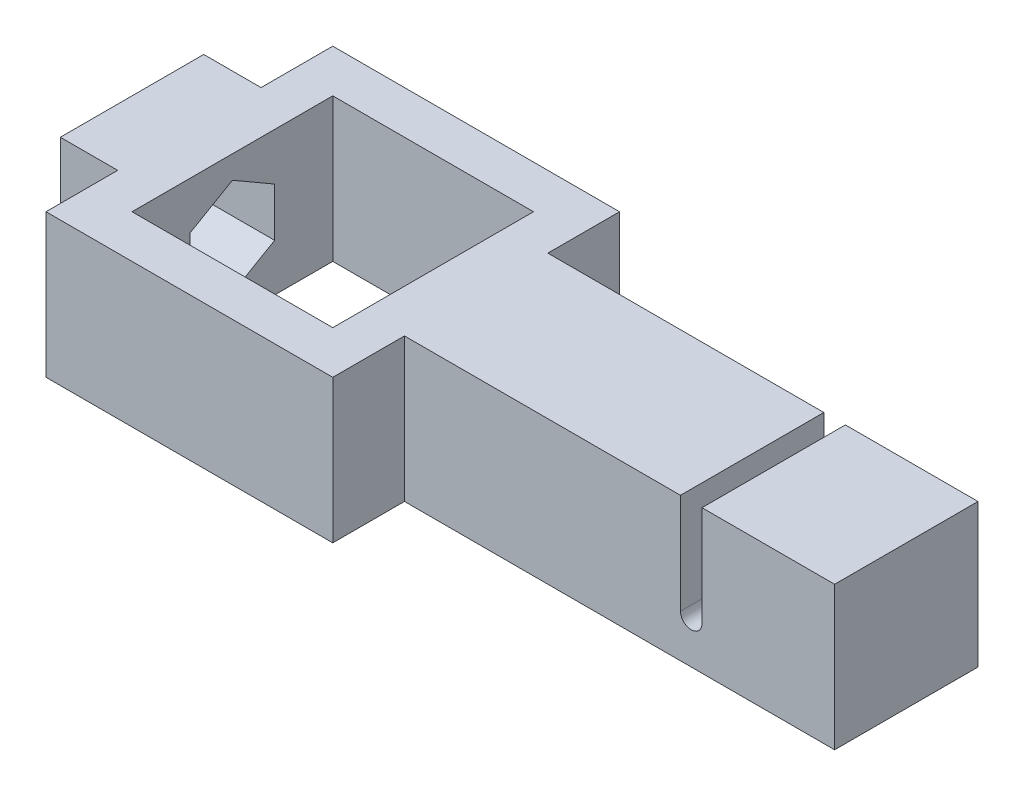
ISO-10303-21;
HEADER;
FILE_DESCRIPTION(('STEP AP214'),'2;1');
FILE_NAME('part.step','',(''),(''),'','','');
FILE_SCHEMA(('AUTOMOTIVE_DESIGN { 1 0 10303 214 1 1 1 1 }'));
ENDSEC;
DATA;
#1=APPLICATION_CONTEXT('core data for automotive mechanical design processes');
#2=APPLICATION_PROTOCOL_DEFINITION('international standard','automotive_design',2000,#1);
#3=PRODUCT_CONTEXT('',#1,'mechanical');
#4=PRODUCT('Part','Part','',(#3));
#5=PRODUCT_RELATED_PRODUCT_CATEGORY('part','',(#4));
#6=PRODUCT_DEFINITION_FORMATION('','',#4);
#7=PRODUCT_DEFINITION_CONTEXT('part definition',#1,'design');
#8=PRODUCT_DEFINITION('design','',#6,#7);
#9=PRODUCT_DEFINITION_SHAPE('','',#8);
#10=(LENGTH_UNIT() NAMED_UNIT(*) SI_UNIT(.MILLI.,.METRE.));
#11=(NAMED_UNIT(*) PLANE_ANGLE_UNIT() SI_UNIT($,.RADIAN.));
#12=(NAMED_UNIT(*) SI_UNIT($,.STERADIAN.) SOLID_ANGLE_UNIT());
#13=UNCERTAINTY_MEASURE_WITH_UNIT(LENGTH_MEASURE(1.E-05),#10,'distance_accuracy_value','');
#14=(GEOMETRIC_REPRESENTATION_CONTEXT(3) GLOBAL_UNCERTAINTY_ASSIGNED_CONTEXT((#13)) GLOBAL_UNIT_ASSIGNED_CONTEXT((#10,
#11,#12)) REPRESENTATION_CONTEXT('',''));
#15=CARTESIAN_POINT('',(0.,0.,0.));
#16=DIRECTION('',(0.,0.,1.));
#17=DIRECTION('',(1.,0.,0.));
#18=AXIS2_PLACEMENT_3D('',#15,#16,#17);
#19=CARTESIAN_POINT('',(0.,10.,0.));
#20=DIRECTION('',(0.,-1.,0.));
#21=DIRECTION('',(0.,0.,-1.));
#22=AXIS2_PLACEMENT_3D('',#19,#20,#21);
#23=PLANE('',#22);
#24=DIRECTION('',(0.,0.,1.));
#25=VECTOR('',#24,1.);
#26=CARTESIAN_POINT('',(-17.,10.,-12.));
#27=LINE('',#26,#25);
#28=CARTESIAN_POINT('',(-17.,10.,-12.));
#29=VERTEX_POINT('',#28);
#30=CARTESIAN_POINT('',(-17.,10.,2.));
#31=VERTEX_POINT('',#30);
#32=EDGE_CURVE('E293',#29,#31,#27,.T.);
#33=ORIENTED_EDGE('',*,*,#32,.F.);
#34=DIRECTION('',(-1.,0.,0.));
#35=VECTOR('',#34,1.);
#36=CARTESIAN_POINT('',(-17.,10.,-12.));
#37=LINE('',#36,#35);
#38=CARTESIAN_POINT('',(-3.,10.,-12.));
#39=VERTEX_POINT('',#38);
#40=EDGE_CURVE('E301',#39,#29,#37,.T.);
#41=ORIENTED_EDGE('',*,*,#40,.F.);
#42=DIRECTION('',(0.,0.,-1.));
#43=VECTOR('',#42,1.);
#44=CARTESIAN_POINT('',(-3.,10.,-12.));
#45=LINE('',#44,#43);
#46=CARTESIAN_POINT('',(-3.,10.,2.));
#47=VERTEX_POINT('',#46);
#48=EDGE_CURVE('E298',#47,#39,#45,.T.);
#49=ORIENTED_EDGE('',*,*,#48,.F.);
#50=DIRECTION('',(1.,0.,0.));
#51=VECTOR('',#50,1.);
#52=CARTESIAN_POINT('',(-17.,10.,2.));
#53=LINE('',#52,#51);
#54=EDGE_CURVE('E295',#31,#47,#53,.T.);
#55=ORIENTED_EDGE('',*,*,#54,.F.);
#56=EDGE_LOOP('',(#33,#41,#49,#55));
#57=FACE_BOUND('',#56,.T.);
#58=DIRECTION('',(1.,0.,0.));
#59=VECTOR('',#58,1.);
#60=CARTESIAN_POINT('',(0.,10.,0.));
#61=LINE('',#60,#59);
#62=CARTESIAN_POINT('',(0.,10.,0.));
#63=VERTEX_POINT('',#62);
#64=CARTESIAN_POINT('',(19.25,10.,0.));
#65=VERTEX_POINT('',#64);
#66=EDGE_CURVE('E329',#63,#65,#61,.T.);
#67=ORIENTED_EDGE('',*,*,#66,.T.);
#68=DIRECTION('',(0.,0.,1.));
#69=VECTOR('',#68,1.);
#70=CARTESIAN_POINT('',(19.25,10.,-15.001));
#71=LINE('',#70,#69);
#72=CARTESIAN_POINT('',(19.25,10.,-10.));
#73=VERTEX_POINT('',#72);
#74=EDGE_CURVE('E281',#73,#65,#71,.T.);
#75=ORIENTED_EDGE('',*,*,#74,.F.);
#76=DIRECTION('',(-1.,0.,0.));
#77=VECTOR('',#76,1.);
#78=CARTESIAN_POINT('',(0.,10.,-10.));
#79=LINE('',#78,#77);
#80=CARTESIAN_POINT('',(0.,10.,-10.));
#81=VERTEX_POINT('',#80);
#82=EDGE_CURVE('E334',#73,#81,#79,.T.);
#83=ORIENTED_EDGE('',*,*,#82,.T.);
#84=DIRECTION('',(0.,0.,-1.));
#85=VECTOR('',#84,1.);
#86=CARTESIAN_POINT('',(0.,10.,-15.));
#87=LINE('',#86,#85);
#88=CARTESIAN_POINT('',(0.,10.,-15.));
#89=VERTEX_POINT('',#88);
#90=EDGE_CURVE('E338',#81,#89,#87,.T.);
#91=ORIENTED_EDGE('',*,*,#90,.T.);
#92=DIRECTION('',(-1.,0.,0.));
#93=VECTOR('',#92,1.);
#94=CARTESIAN_POINT('',(-20.,10.,-15.));
#95=LINE('',#94,#93);
#96=CARTESIAN_POINT('',(-20.,10.,-15.));
#97=VERTEX_POINT('',#96);
#98=EDGE_CURVE('E340',#89,#97,#95,.T.);
#99=ORIENTED_EDGE('',*,*,#98,.T.);
#100=DIRECTION('',(0.,0.,1.));
#101=VECTOR('',#100,1.);
#102=CARTESIAN_POINT('',(-20.,10.,-10.));
#103=LINE('',#102,#101);
#104=CARTESIAN_POINT('',(-20.,10.,-10.));
#105=VERTEX_POINT('',#104);
#106=EDGE_CURVE('E342',#97,#105,#103,.T.);
#107=ORIENTED_EDGE('',*,*,#106,.T.);
#108=DIRECTION('',(-1.,0.,0.));
#109=VECTOR('',#108,1.);
#110=CARTESIAN_POINT('',(-20.,10.,-10.));
#111=LINE('',#110,#109);
#112=CARTESIAN_POINT('',(-24.,10.,-10.));
#113=VERTEX_POINT('',#112);
#114=EDGE_CURVE('E344',#105,#113,#111,.T.);
#115=ORIENTED_EDGE('',*,*,#114,.T.);
#116=DIRECTION('',(0.,0.,1.));
#117=VECTOR('',#116,1.);
#118=CARTESIAN_POINT('',(-24.,10.,-10.));
#119=LINE('',#118,#117);
#120=CARTESIAN_POINT('',(-24.,10.,0.));
#121=VERTEX_POINT('',#120);
#122=EDGE_CURVE('E346',#113,#121,#119,.T.);
#123=ORIENTED_EDGE('',*,*,#122,.T.);
#124=DIRECTION('',(1.,0.,0.));
#125=VECTOR('',#124,1.);
#126=CARTESIAN_POINT('',(-24.,10.,0.));
#127=LINE('',#126,#125);
#128=CARTESIAN_POINT('',(-20.,10.,0.));
#129=VERTEX_POINT('',#128);
#130=EDGE_CURVE('E348',#121,#129,#127,.T.);
#131=ORIENTED_EDGE('',*,*,#130,.T.);
#132=DIRECTION('',(0.,0.,1.));
#133=VECTOR('',#132,1.);
#134=CARTESIAN_POINT('',(-20.,10.,5.));
#135=LINE('',#134,#133);
#136=CARTESIAN_POINT('',(-20.,10.,5.));
#137=VERTEX_POINT('',#136);
#138=EDGE_CURVE('E350',#129,#137,#135,.T.);
#139=ORIENTED_EDGE('',*,*,#138,.T.);
#140=DIRECTION('',(1.,0.,0.));
#141=VECTOR('',#140,1.);
#142=CARTESIAN_POINT('',(0.,10.,5.));
#143=LINE('',#142,#141);
#144=CARTESIAN_POINT('',(0.,10.,5.));
#145=VERTEX_POINT('',#144);
#146=EDGE_CURVE('E352',#137,#145,#143,.T.);
#147=ORIENTED_EDGE('',*,*,#146,.T.);
#148=DIRECTION('',(0.,0.,-1.));
#149=VECTOR('',#148,1.);
#150=CARTESIAN_POINT('',(0.,10.,0.));
#151=LINE('',#150,#149);
#152=EDGE_CURVE('E324',#145,#63,#151,.T.);
#153=ORIENTED_EDGE('',*,*,#152,.T.);
#154=EDGE_LOOP('',(#67,#75,#83,#91,#99,#107,#115,#123,#131,#139,#147,#153));
#155=FACE_BOUND('',#154,.T.);
#156=ADVANCED_FACE('F32',(#57,#155),#23,.F.);
#157=CARTESIAN_POINT('',(30.,10.,-10.));
#158=VERTEX_POINT('',#157);
#159=CARTESIAN_POINT('',(20.75,10.,-10.));
#160=VERTEX_POINT('',#159);
#161=EDGE_CURVE('E335',#158,#160,#79,.T.);
#162=ORIENTED_EDGE('',*,*,#161,.T.);
#163=DIRECTION('',(0.,0.,1.));
#164=VECTOR('',#163,1.);
#165=CARTESIAN_POINT('',(20.75,10.,-15.001));
#166=LINE('',#165,#164);
#167=CARTESIAN_POINT('',(20.75,10.,0.));
#168=VERTEX_POINT('',#167);
#169=EDGE_CURVE('E284',#160,#168,#166,.T.);
#170=ORIENTED_EDGE('',*,*,#169,.T.);
#171=CARTESIAN_POINT('',(30.,10.,0.));
#172=VERTEX_POINT('',#171);
#173=EDGE_CURVE('E327',#168,#172,#61,.T.);
#174=ORIENTED_EDGE('',*,*,#173,.T.);
#175=DIRECTION('',(0.,0.,-1.));
#176=VECTOR('',#175,1.);
#177=CARTESIAN_POINT('',(30.,10.,0.));
#178=LINE('',#177,#176);
#179=EDGE_CURVE('E332',#172,#158,#178,.T.);
#180=ORIENTED_EDGE('',*,*,#179,.T.);
#181=EDGE_LOOP('',(#162,#170,#174,#180));
#182=FACE_BOUND('',#181,.T.);
#183=ADVANCED_FACE('F446',(#182),#23,.F.);
#184=CARTESIAN_POINT('',(0.,0.,0.));
#185=DIRECTION('',(0.,-1.,0.));
#186=DIRECTION('',(0.,0.,-1.));
#187=AXIS2_PLACEMENT_3D('',#184,#185,#186);
#188=PLANE('',#187);
#189=DIRECTION('',(0.,0.,-1.));
#190=VECTOR('',#189,1.);
#191=CARTESIAN_POINT('',(0.,0.,0.));
#192=LINE('',#191,#190);
#193=CARTESIAN_POINT('',(0.,0.,5.));
#194=VERTEX_POINT('',#193);
#195=CARTESIAN_POINT('',(0.,0.,0.));
#196=VERTEX_POINT('',#195);
#197=EDGE_CURVE('E323',#194,#196,#192,.T.);
#198=ORIENTED_EDGE('',*,*,#197,.F.);
#199=DIRECTION('',(1.,0.,0.));
#200=VECTOR('',#199,1.);
#201=CARTESIAN_POINT('',(0.,0.,5.));
#202=LINE('',#201,#200);
#203=CARTESIAN_POINT('',(-20.,0.,5.));
#204=VERTEX_POINT('',#203);
#205=EDGE_CURVE('E328',#204,#194,#202,.T.);
#206=ORIENTED_EDGE('',*,*,#205,.F.);
#207=DIRECTION('',(0.,0.,1.));
#208=VECTOR('',#207,1.);
#209=CARTESIAN_POINT('',(-20.,0.,5.));
#210=LINE('',#209,#208);
#211=CARTESIAN_POINT('',(-20.,0.,0.));
#212=VERTEX_POINT('',#211);
#213=EDGE_CURVE('E375',#212,#204,#210,.T.);
#214=ORIENTED_EDGE('',*,*,#213,.F.);
#215=DIRECTION('',(1.,0.,0.));
#216=VECTOR('',#215,1.);
#217=CARTESIAN_POINT('',(-24.,0.,0.));
#218=LINE('',#217,#216);
#219=CARTESIAN_POINT('',(-24.,0.,0.));
#220=VERTEX_POINT('',#219);
#221=EDGE_CURVE('E373',#220,#212,#218,.T.);
#222=ORIENTED_EDGE('',*,*,#221,.F.);
#223=DIRECTION('',(0.,0.,1.));
#224=VECTOR('',#223,1.);
#225=CARTESIAN_POINT('',(-24.,0.,-10.));
#226=LINE('',#225,#224);
#227=CARTESIAN_POINT('',(-24.,0.,-10.));
#228=VERTEX_POINT('',#227);
#229=EDGE_CURVE('E371',#228,#220,#226,.T.);
#230=ORIENTED_EDGE('',*,*,#229,.F.);
#231=DIRECTION('',(-1.,0.,0.));
#232=VECTOR('',#231,1.);
#233=CARTESIAN_POINT('',(-20.,0.,-10.));
#234=LINE('',#233,#232);
#235=CARTESIAN_POINT('',(-20.,0.,-10.));
#236=VERTEX_POINT('',#235);
#237=EDGE_CURVE('E369',#236,#228,#234,.T.);
#238=ORIENTED_EDGE('',*,*,#237,.F.);
#239=DIRECTION('',(0.,0.,1.));
#240=VECTOR('',#239,1.);
#241=CARTESIAN_POINT('',(-20.,0.,-10.));
#242=LINE('',#241,#240);
#243=CARTESIAN_POINT('',(-20.,0.,-15.));
#244=VERTEX_POINT('',#243);
#245=EDGE_CURVE('E367',#244,#236,#242,.T.);
#246=ORIENTED_EDGE('',*,*,#245,.F.);
#247=DIRECTION('',(-1.,0.,0.));
#248=VECTOR('',#247,1.);
#249=CARTESIAN_POINT('',(-20.,0.,-15.));
#250=LINE('',#249,#248);
#251=CARTESIAN_POINT('',(0.,0.,-15.));
#252=VERTEX_POINT('',#251);
#253=EDGE_CURVE('E365',#252,#244,#250,.T.);
#254=ORIENTED_EDGE('',*,*,#253,.F.);
#255=DIRECTION('',(0.,0.,-1.));
#256=VECTOR('',#255,1.);
#257=CARTESIAN_POINT('',(0.,0.,-15.));
#258=LINE('',#257,#256);
#259=CARTESIAN_POINT('',(0.,0.,-10.));
#260=VERTEX_POINT('',#259);
#261=EDGE_CURVE('E363',#260,#252,#258,.T.);
#262=ORIENTED_EDGE('',*,*,#261,.F.);
#263=DIRECTION('',(-1.,0.,0.));
#264=VECTOR('',#263,1.);
#265=CARTESIAN_POINT('',(0.,0.,-10.));
#266=LINE('',#265,#264);
#267=CARTESIAN_POINT('',(30.,0.,-10.));
#268=VERTEX_POINT('',#267);
#269=EDGE_CURVE('E361',#268,#260,#266,.T.);
#270=ORIENTED_EDGE('',*,*,#269,.F.);
#271=DIRECTION('',(0.,0.,-1.));
#272=VECTOR('',#271,1.);
#273=CARTESIAN_POINT('',(30.,0.,0.));
#274=LINE('',#273,#272);
#275=CARTESIAN_POINT('',(30.,0.,0.));
#276=VERTEX_POINT('',#275);
#277=EDGE_CURVE('E359',#276,#268,#274,.T.);
#278=ORIENTED_EDGE('',*,*,#277,.F.);
#279=DIRECTION('',(1.,0.,0.));
#280=VECTOR('',#279,1.);
#281=CARTESIAN_POINT('',(0.,0.,0.));
#282=LINE('',#281,#280);
#283=EDGE_CURVE('E357',#196,#276,#282,.T.);
#284=ORIENTED_EDGE('',*,*,#283,.F.);
#285=EDGE_LOOP('',(#198,#206,#214,#222,#230,#238,#246,#254,#262,#270,#278,#284));
#286=FACE_BOUND('',#285,.T.);
#287=DIRECTION('',(-1.,0.,0.));
#288=VECTOR('',#287,1.);
#289=CARTESIAN_POINT('',(-17.,0.,-12.));
#290=LINE('',#289,#288);
#291=CARTESIAN_POINT('',(-3.,0.,-12.));
#292=VERTEX_POINT('',#291);
#293=CARTESIAN_POINT('',(-17.,0.,-12.));
#294=VERTEX_POINT('',#293);
#295=EDGE_CURVE('E296',#292,#294,#290,.T.);
#296=ORIENTED_EDGE('',*,*,#295,.T.);
#297=DIRECTION('',(0.,0.,1.));
#298=VECTOR('',#297,1.);
#299=CARTESIAN_POINT('',(-17.,0.,-12.));
#300=LINE('',#299,#298);
#301=CARTESIAN_POINT('',(-17.,0.,2.));
#302=VERTEX_POINT('',#301);
#303=EDGE_CURVE('E292',#294,#302,#300,.T.);
#304=ORIENTED_EDGE('',*,*,#303,.T.);
#305=DIRECTION('',(1.,0.,0.));
#306=VECTOR('',#305,1.);
#307=CARTESIAN_POINT('',(-17.,0.,2.));
#308=LINE('',#307,#306);
#309=CARTESIAN_POINT('',(-3.,0.,2.));
#310=VERTEX_POINT('',#309);
#311=EDGE_CURVE('E306',#302,#310,#308,.T.);
#312=ORIENTED_EDGE('',*,*,#311,.T.);
#313=DIRECTION('',(0.,0.,-1.));
#314=VECTOR('',#313,1.);
#315=CARTESIAN_POINT('',(-3.,0.,-12.));
#316=LINE('',#315,#314);
#317=EDGE_CURVE('E309',#310,#292,#316,.T.);
#318=ORIENTED_EDGE('',*,*,#317,.T.);
#319=EDGE_LOOP('',(#296,#304,#312,#318));
#320=FACE_BOUND('',#319,.T.);
#321=ADVANCED_FACE('F418',(#286,#320),#188,.T.);
#322=CARTESIAN_POINT('',(0.,10.,0.));
#323=DIRECTION('',(-1.,0.,0.));
#324=DIRECTION('',(0.,0.,1.));
#325=AXIS2_PLACEMENT_3D('',#322,#323,#324);
#326=PLANE('',#325);
#327=ORIENTED_EDGE('',*,*,#197,.T.);
#328=DIRECTION('',(0.,-1.,0.));
#329=VECTOR('',#328,1.);
#330=CARTESIAN_POINT('',(0.,10.,0.));
#331=LINE('',#330,#329);
#332=EDGE_CURVE('E11',#63,#196,#331,.T.);
#333=ORIENTED_EDGE('',*,*,#332,.F.);
#334=ORIENTED_EDGE('',*,*,#152,.F.);
#335=DIRECTION('',(0.,-1.,0.));
#336=VECTOR('',#335,1.);
#337=CARTESIAN_POINT('',(0.,10.,5.));
#338=LINE('',#337,#336);
#339=EDGE_CURVE('E354',#145,#194,#338,.T.);
#340=ORIENTED_EDGE('',*,*,#339,.T.);
#341=EDGE_LOOP('',(#327,#333,#334,#340));
#342=FACE_BOUND('',#341,.T.);
#343=ADVANCED_FACE('F34',(#342),#326,.F.);
#344=CARTESIAN_POINT('',(0.,10.,0.));
#345=DIRECTION('',(0.,0.,-1.));
#346=DIRECTION('',(-1.,0.,0.));
#347=AXIS2_PLACEMENT_3D('',#344,#345,#346);
#348=PLANE('',#347);
#349=CARTESIAN_POINT('',(20.,3.,0.));
#350=DIRECTION('',(0.,0.,1.));
#351=DIRECTION('',(1.,0.,0.));
#352=AXIS2_PLACEMENT_3D('',#349,#350,#351);
#353=CIRCLE('',#352,0.750000000000001);
#354=CARTESIAN_POINT('',(19.25,3.,0.));
#355=VERTEX_POINT('',#354);
#356=CARTESIAN_POINT('',(20.75,3.,0.));
#357=VERTEX_POINT('',#356);
#358=EDGE_CURVE('E275',#355,#357,#353,.T.);
#359=ORIENTED_EDGE('',*,*,#358,.F.);
#360=DIRECTION('',(0.,-1.,0.));
#361=VECTOR('',#360,1.);
#362=CARTESIAN_POINT('',(19.25,10.,0.));
#363=LINE('',#362,#361);
#364=EDGE_CURVE('E272',#65,#355,#363,.T.);
#365=ORIENTED_EDGE('',*,*,#364,.F.);
#366=ORIENTED_EDGE('',*,*,#66,.F.);
#367=ORIENTED_EDGE('',*,*,#332,.T.);
#368=ORIENTED_EDGE('',*,*,#283,.T.);
#369=DIRECTION('',(0.,-1.,0.));
#370=VECTOR('',#369,1.);
#371=CARTESIAN_POINT('',(30.,10.,0.));
#372=LINE('',#371,#370);
#373=EDGE_CURVE('E40',#172,#276,#372,.T.);
#374=ORIENTED_EDGE('',*,*,#373,.F.);
#375=ORIENTED_EDGE('',*,*,#173,.F.);
#376=DIRECTION('',(0.,1.,0.));
#377=VECTOR('',#376,1.);
#378=CARTESIAN_POINT('',(20.75,10.,0.));
#379=LINE('',#378,#377);
#380=EDGE_CURVE('E278',#357,#168,#379,.T.);
#381=ORIENTED_EDGE('',*,*,#380,.F.);
#382=EDGE_LOOP('',(#359,#365,#366,#367,#368,#374,#375,#381));
#383=FACE_BOUND('',#382,.T.);
#384=ADVANCED_FACE('F447',(#383),#348,.F.);
#385=CARTESIAN_POINT('',(30.,10.,0.));
#386=DIRECTION('',(-1.,0.,0.));
#387=DIRECTION('',(0.,0.,1.));
#388=AXIS2_PLACEMENT_3D('',#385,#386,#387);
#389=PLANE('',#388);
#390=ORIENTED_EDGE('',*,*,#277,.T.);
#391=DIRECTION('',(0.,-1.,0.));
#392=VECTOR('',#391,1.);
#393=CARTESIAN_POINT('',(30.,10.,-10.));
#394=LINE('',#393,#392);
#395=EDGE_CURVE('E404',#158,#268,#394,.T.);
#396=ORIENTED_EDGE('',*,*,#395,.F.);
#397=ORIENTED_EDGE('',*,*,#179,.F.);
#398=ORIENTED_EDGE('',*,*,#373,.T.);
#399=EDGE_LOOP('',(#390,#396,#397,#398));
#400=FACE_BOUND('',#399,.T.);
#401=ADVANCED_FACE('F411',(#400),#389,.F.);
#402=CARTESIAN_POINT('',(0.,10.,-10.));
#403=DIRECTION('',(0.,0.,1.));
#404=DIRECTION('',(1.,0.,0.));
#405=AXIS2_PLACEMENT_3D('',#402,#403,#404);
#406=PLANE('',#405);
#407=ORIENTED_EDGE('',*,*,#82,.F.);
#408=DIRECTION('',(0.,1.,0.));
#409=VECTOR('',#408,1.);
#410=CARTESIAN_POINT('',(19.25,10.,-10.));
#411=LINE('',#410,#409);
#412=CARTESIAN_POINT('',(19.25,3.,-10.));
#413=VERTEX_POINT('',#412);
#414=EDGE_CURVE('E270',#413,#73,#411,.T.);
#415=ORIENTED_EDGE('',*,*,#414,.F.);
#416=CARTESIAN_POINT('',(20.,3.,-10.));
#417=DIRECTION('',(0.,0.,1.));
#418=DIRECTION('',(1.,0.,0.));
#419=AXIS2_PLACEMENT_3D('',#416,#417,#418);
#420=CIRCLE('',#419,0.750000000000001);
#421=CARTESIAN_POINT('',(20.75,3.,-10.));
#422=VERTEX_POINT('',#421);
#423=EDGE_CURVE('E283',#422,#413,#420,.F.);
#424=ORIENTED_EDGE('',*,*,#423,.F.);
#425=DIRECTION('',(0.,-1.,0.));
#426=VECTOR('',#425,1.);
#427=CARTESIAN_POINT('',(20.75,10.,-10.));
#428=LINE('',#427,#426);
#429=EDGE_CURVE('E55',#160,#422,#428,.T.);
#430=ORIENTED_EDGE('',*,*,#429,.F.);
#431=ORIENTED_EDGE('',*,*,#161,.F.);
#432=ORIENTED_EDGE('',*,*,#395,.T.);
#433=ORIENTED_EDGE('',*,*,#269,.T.);
#434=DIRECTION('',(0.,-1.,0.));
#435=VECTOR('',#434,1.);
#436=CARTESIAN_POINT('',(0.,10.,-10.));
#437=LINE('',#436,#435);
#438=EDGE_CURVE('E401',#81,#260,#437,.T.);
#439=ORIENTED_EDGE('',*,*,#438,.F.);
#440=EDGE_LOOP('',(#407,#415,#424,#430,#431,#432,#433,#439));
#441=FACE_BOUND('',#440,.T.);
#442=ADVANCED_FACE('F425',(#441),#406,.F.);
#443=CARTESIAN_POINT('',(0.,10.,-15.));
#444=DIRECTION('',(-1.,0.,0.));
#445=DIRECTION('',(0.,0.,1.));
#446=AXIS2_PLACEMENT_3D('',#443,#444,#445);
#447=PLANE('',#446);
#448=ORIENTED_EDGE('',*,*,#261,.T.);
#449=DIRECTION('',(0.,-1.,0.));
#450=VECTOR('',#449,1.);
#451=CARTESIAN_POINT('',(0.,10.,-15.));
#452=LINE('',#451,#450);
#453=EDGE_CURVE('E398',#89,#252,#452,.T.);
#454=ORIENTED_EDGE('',*,*,#453,.F.);
#455=ORIENTED_EDGE('',*,*,#90,.F.);
#456=ORIENTED_EDGE('',*,*,#438,.T.);
#457=EDGE_LOOP('',(#448,#454,#455,#456));
#458=FACE_BOUND('',#457,.T.);
#459=ADVANCED_FACE('F429',(#458),#447,.F.);
#460=CARTESIAN_POINT('',(-20.,10.,-15.));
#461=DIRECTION('',(0.,0.,1.));
#462=DIRECTION('',(1.,0.,0.));
#463=AXIS2_PLACEMENT_3D('',#460,#461,#462);
#464=PLANE('',#463);
#465=ORIENTED_EDGE('',*,*,#253,.T.);
#466=DIRECTION('',(0.,-1.,0.));
#467=VECTOR('',#466,1.);
#468=CARTESIAN_POINT('',(-20.,10.,-15.));
#469=LINE('',#468,#467);
#470=EDGE_CURVE('E395',#97,#244,#469,.T.);
#471=ORIENTED_EDGE('',*,*,#470,.F.);
#472=ORIENTED_EDGE('',*,*,#98,.F.);
#473=ORIENTED_EDGE('',*,*,#453,.T.);
#474=EDGE_LOOP('',(#465,#471,#472,#473));
#475=FACE_BOUND('',#474,.T.);
#476=ADVANCED_FACE('F491',(#475),#464,.F.);
#477=CARTESIAN_POINT('',(-20.,10.,-10.));
#478=DIRECTION('',(1.,0.,0.));
#479=DIRECTION('',(0.,0.,-1.));
#480=AXIS2_PLACEMENT_3D('',#477,#478,#479);
#481=PLANE('',#480);
#482=ORIENTED_EDGE('',*,*,#245,.T.);
#483=DIRECTION('',(0.,-1.,0.));
#484=VECTOR('',#483,1.);
#485=CARTESIAN_POINT('',(-20.,10.,-10.));
#486=LINE('',#485,#484);
#487=EDGE_CURVE('E392',#105,#236,#486,.T.);
#488=ORIENTED_EDGE('',*,*,#487,.F.);
#489=ORIENTED_EDGE('',*,*,#106,.F.);
#490=ORIENTED_EDGE('',*,*,#470,.T.);
#491=EDGE_LOOP('',(#482,#488,#489,#490));
#492=FACE_BOUND('',#491,.T.);
#493=ADVANCED_FACE('F487',(#492),#481,.F.);
#494=CARTESIAN_POINT('',(-20.,10.,-10.));
#495=DIRECTION('',(0.,0.,1.));
#496=DIRECTION('',(1.,0.,0.));
#497=AXIS2_PLACEMENT_3D('',#494,#495,#496);
#498=PLANE('',#497);
#499=ORIENTED_EDGE('',*,*,#237,.T.);
#500=DIRECTION('',(0.,-1.,0.));
#501=VECTOR('',#500,1.);
#502=CARTESIAN_POINT('',(-24.,10.,-10.));
#503=LINE('',#502,#501);
#504=EDGE_CURVE('E389',#113,#228,#503,.T.);
#505=ORIENTED_EDGE('',*,*,#504,.F.);
#506=ORIENTED_EDGE('',*,*,#114,.F.);
#507=ORIENTED_EDGE('',*,*,#487,.T.);
#508=EDGE_LOOP('',(#499,#505,#506,#507));
#509=FACE_BOUND('',#508,.T.);
#510=ADVANCED_FACE('F483',(#509),#498,.F.);
#511=CARTESIAN_POINT('',(-24.,10.,-10.));
#512=DIRECTION('',(1.,0.,0.));
#513=DIRECTION('',(0.,0.,-1.));
#514=AXIS2_PLACEMENT_3D('',#511,#512,#513);
#515=PLANE('',#514);
#516=CARTESIAN_POINT('',(-24.,5.,-4.99999999999999));
#517=DIRECTION('',(-1.,0.,0.));
#518=DIRECTION('',(0.,0.,1.));
#519=AXIS2_PLACEMENT_3D('',#516,#517,#518);
#520=CIRCLE('',#519,1.85);
#521=CARTESIAN_POINT('',(-24.,5.,-3.14999999999999));
#522=VERTEX_POINT('',#521);
#523=EDGE_CURVE('E236',#522,#522,#520,.T.);
#524=ORIENTED_EDGE('',*,*,#523,.F.);
#525=EDGE_LOOP('',(#524));
#526=FACE_BOUND('',#525,.T.);
#527=ORIENTED_EDGE('',*,*,#229,.T.);
#528=DIRECTION('',(0.,-1.,0.));
#529=VECTOR('',#528,1.);
#530=CARTESIAN_POINT('',(-24.,10.,0.));
#531=LINE('',#530,#529);
#532=EDGE_CURVE('E386',#121,#220,#531,.T.);
#533=ORIENTED_EDGE('',*,*,#532,.F.);
#534=ORIENTED_EDGE('',*,*,#122,.F.);
#535=ORIENTED_EDGE('',*,*,#504,.T.);
#536=EDGE_LOOP('',(#527,#533,#534,#535));
#537=FACE_BOUND('',#536,.T.);
#538=ADVANCED_FACE('F479',(#526,#537),#515,.F.);
#539=CARTESIAN_POINT('',(-24.,10.,0.));
#540=DIRECTION('',(0.,0.,-1.));
#541=DIRECTION('',(-1.,0.,0.));
#542=AXIS2_PLACEMENT_3D('',#539,#540,#541);
#543=PLANE('',#542);
#544=ORIENTED_EDGE('',*,*,#221,.T.);
#545=DIRECTION('',(0.,-1.,0.));
#546=VECTOR('',#545,1.);
#547=CARTESIAN_POINT('',(-20.,10.,0.));
#548=LINE('',#547,#546);
#549=EDGE_CURVE('E383',#129,#212,#548,.T.);
#550=ORIENTED_EDGE('',*,*,#549,.F.);
#551=ORIENTED_EDGE('',*,*,#130,.F.);
#552=ORIENTED_EDGE('',*,*,#532,.T.);
#553=EDGE_LOOP('',(#544,#550,#551,#552));
#554=FACE_BOUND('',#553,.T.);
#555=ADVANCED_FACE('F475',(#554),#543,.F.);
#556=CARTESIAN_POINT('',(-20.,10.,5.));
#557=DIRECTION('',(1.,0.,0.));
#558=DIRECTION('',(0.,0.,-1.));
#559=AXIS2_PLACEMENT_3D('',#556,#557,#558);
#560=PLANE('',#559);
#561=ORIENTED_EDGE('',*,*,#213,.T.);
#562=DIRECTION('',(0.,-1.,0.));
#563=VECTOR('',#562,1.);
#564=CARTESIAN_POINT('',(-20.,10.,5.));
#565=LINE('',#564,#563);
#566=EDGE_CURVE('E380',#137,#204,#565,.T.);
#567=ORIENTED_EDGE('',*,*,#566,.F.);
#568=ORIENTED_EDGE('',*,*,#138,.F.);
#569=ORIENTED_EDGE('',*,*,#549,.T.);
#570=EDGE_LOOP('',(#561,#567,#568,#569));
#571=FACE_BOUND('',#570,.T.);
#572=ADVANCED_FACE('F471',(#571),#560,.F.);
#573=CARTESIAN_POINT('',(0.,10.,5.));
#574=DIRECTION('',(0.,0.,-1.));
#575=DIRECTION('',(-1.,0.,0.));
#576=AXIS2_PLACEMENT_3D('',#573,#574,#575);
#577=PLANE('',#576);
#578=ORIENTED_EDGE('',*,*,#205,.T.);
#579=ORIENTED_EDGE('',*,*,#339,.F.);
#580=ORIENTED_EDGE('',*,*,#146,.F.);
#581=ORIENTED_EDGE('',*,*,#566,.T.);
#582=EDGE_LOOP('',(#578,#579,#580,#581));
#583=FACE_BOUND('',#582,.T.);
#584=ADVANCED_FACE('F468',(#583),#577,.F.);
#585=CARTESIAN_POINT('',(-17.,10.,-12.));
#586=DIRECTION('',(1.,0.,0.));
#587=DIRECTION('',(0.,0.,-1.));
#588=AXIS2_PLACEMENT_3D('',#585,#586,#587);
#589=PLANE('',#588);
#590=DIRECTION('',(0.,0.5,-0.866025403784439));
#591=VECTOR('',#590,1.);
#592=CARTESIAN_POINT('',(-17.,6.7,-2.05551362713291));
#593=LINE('',#592,#591);
#594=CARTESIAN_POINT('',(-17.,6.7,-2.05551362713291));
#595=VERTEX_POINT('',#594);
#596=CARTESIAN_POINT('',(-17.,8.4,-5.));
#597=VERTEX_POINT('',#596);
#598=EDGE_CURVE('E211',#595,#597,#593,.T.);
#599=ORIENTED_EDGE('',*,*,#598,.T.);
#600=DIRECTION('',(0.,-0.5,-0.866025403784438));
#601=VECTOR('',#600,1.);
#602=CARTESIAN_POINT('',(-17.,8.4,-5.));
#603=LINE('',#602,#601);
#604=CARTESIAN_POINT('',(-17.,6.7,-7.94448637286709));
#605=VERTEX_POINT('',#604);
#606=EDGE_CURVE('E241',#597,#605,#603,.T.);
#607=ORIENTED_EDGE('',*,*,#606,.T.);
#608=DIRECTION('',(0.,-1.,0.));
#609=VECTOR('',#608,1.);
#610=CARTESIAN_POINT('',(-17.,6.7,-7.94448637286709));
#611=LINE('',#610,#609);
#612=CARTESIAN_POINT('',(-17.,3.3,-7.94448637286709));
#613=VERTEX_POINT('',#612);
#614=EDGE_CURVE('E258',#605,#613,#611,.T.);
#615=ORIENTED_EDGE('',*,*,#614,.T.);
#616=DIRECTION('',(0.,-0.5,0.866025403784439));
#617=VECTOR('',#616,1.);
#618=CARTESIAN_POINT('',(-17.,3.3,-7.94448637286709));
#619=LINE('',#618,#617);
#620=CARTESIAN_POINT('',(-17.,1.6,-5.));
#621=VERTEX_POINT('',#620);
#622=EDGE_CURVE('E254',#613,#621,#619,.T.);
#623=ORIENTED_EDGE('',*,*,#622,.T.);
#624=DIRECTION('',(0.,0.5,0.866025403784439));
#625=VECTOR('',#624,1.);
#626=CARTESIAN_POINT('',(-17.,1.6,-5.));
#627=LINE('',#626,#625);
#628=CARTESIAN_POINT('',(-17.,3.3,-2.05551362713291));
#629=VERTEX_POINT('',#628);
#630=EDGE_CURVE('E215',#621,#629,#627,.T.);
#631=ORIENTED_EDGE('',*,*,#630,.T.);
#632=DIRECTION('',(0.,1.,0.));
#633=VECTOR('',#632,1.);
#634=CARTESIAN_POINT('',(-17.,3.3,-2.05551362713291));
#635=LINE('',#634,#633);
#636=EDGE_CURVE('E216',#629,#595,#635,.T.);
#637=ORIENTED_EDGE('',*,*,#636,.T.);
#638=EDGE_LOOP('',(#599,#607,#615,#623,#631,#637));
#639=FACE_BOUND('',#638,.T.);
#640=ORIENTED_EDGE('',*,*,#303,.F.);
#641=DIRECTION('',(0.,-1.,0.));
#642=VECTOR('',#641,1.);
#643=CARTESIAN_POINT('',(-17.,10.,-12.));
#644=LINE('',#643,#642);
#645=EDGE_CURVE('E303',#29,#294,#644,.T.);
#646=ORIENTED_EDGE('',*,*,#645,.F.);
#647=ORIENTED_EDGE('',*,*,#32,.T.);
#648=DIRECTION('',(0.,-1.,0.));
#649=VECTOR('',#648,1.);
#650=CARTESIAN_POINT('',(-17.,10.,2.));
#651=LINE('',#650,#649);
#652=EDGE_CURVE('E320',#31,#302,#651,.T.);
#653=ORIENTED_EDGE('',*,*,#652,.T.);
#654=EDGE_LOOP('',(#640,#646,#647,#653));
#655=FACE_BOUND('',#654,.T.);
#656=ADVANCED_FACE('F464',(#639,#655),#589,.T.);
#657=CARTESIAN_POINT('',(-17.,10.,2.));
#658=DIRECTION('',(0.,0.,-1.));
#659=DIRECTION('',(-1.,0.,0.));
#660=AXIS2_PLACEMENT_3D('',#657,#658,#659);
#661=PLANE('',#660);
#662=ORIENTED_EDGE('',*,*,#311,.F.);
#663=ORIENTED_EDGE('',*,*,#652,.F.);
#664=ORIENTED_EDGE('',*,*,#54,.T.);
#665=DIRECTION('',(0.,-1.,0.));
#666=VECTOR('',#665,1.);
#667=CARTESIAN_POINT('',(-3.,10.,2.));
#668=LINE('',#667,#666);
#669=EDGE_CURVE('E318',#47,#310,#668,.T.);
#670=ORIENTED_EDGE('',*,*,#669,.T.);
#671=EDGE_LOOP('',(#662,#663,#664,#670));
#672=FACE_BOUND('',#671,.T.);
#673=ADVANCED_FACE('F545',(#672),#661,.T.);
#674=CARTESIAN_POINT('',(-3.,10.,-12.));
#675=DIRECTION('',(-1.,0.,0.));
#676=DIRECTION('',(0.,0.,1.));
#677=AXIS2_PLACEMENT_3D('',#674,#675,#676);
#678=PLANE('',#677);
#679=ORIENTED_EDGE('',*,*,#317,.F.);
#680=ORIENTED_EDGE('',*,*,#669,.F.);
#681=ORIENTED_EDGE('',*,*,#48,.T.);
#682=DIRECTION('',(0.,-1.,0.));
#683=VECTOR('',#682,1.);
#684=CARTESIAN_POINT('',(-3.,10.,-12.));
#685=LINE('',#684,#683);
#686=EDGE_CURVE('E316',#39,#292,#685,.T.);
#687=ORIENTED_EDGE('',*,*,#686,.T.);
#688=EDGE_LOOP('',(#679,#680,#681,#687));
#689=FACE_BOUND('',#688,.T.);
#690=ADVANCED_FACE('F552',(#689),#678,.T.);
#691=CARTESIAN_POINT('',(-17.,10.,-12.));
#692=DIRECTION('',(0.,0.,1.));
#693=DIRECTION('',(1.,0.,0.));
#694=AXIS2_PLACEMENT_3D('',#691,#692,#693);
#695=PLANE('',#694);
#696=ORIENTED_EDGE('',*,*,#295,.F.);
#697=ORIENTED_EDGE('',*,*,#686,.F.);
#698=ORIENTED_EDGE('',*,*,#40,.T.);
#699=ORIENTED_EDGE('',*,*,#645,.T.);
#700=EDGE_LOOP('',(#696,#697,#698,#699));
#701=FACE_BOUND('',#700,.T.);
#702=ADVANCED_FACE('F559',(#701),#695,.T.);
#703=CARTESIAN_POINT('',(19.25,10.,-15.001));
#704=DIRECTION('',(-1.,0.,0.));
#705=DIRECTION('',(0.,0.,1.));
#706=AXIS2_PLACEMENT_3D('',#703,#704,#705);
#707=PLANE('',#706);
#708=ORIENTED_EDGE('',*,*,#414,.T.);
#709=ORIENTED_EDGE('',*,*,#74,.T.);
#710=ORIENTED_EDGE('',*,*,#364,.T.);
#711=DIRECTION('',(0.,0.,1.));
#712=VECTOR('',#711,1.);
#713=CARTESIAN_POINT('',(19.25,3.,-15.001));
#714=LINE('',#713,#712);
#715=EDGE_CURVE('E280',#413,#355,#714,.T.);
#716=ORIENTED_EDGE('',*,*,#715,.F.);
#717=EDGE_LOOP('',(#708,#709,#710,#716));
#718=FACE_BOUND('',#717,.T.);
#719=ADVANCED_FACE('F438',(#718),#707,.F.);
#720=CARTESIAN_POINT('',(20.75,10.,-15.001));
#721=DIRECTION('',(1.,0.,0.));
#722=DIRECTION('',(0.,1.,0.));
#723=AXIS2_PLACEMENT_3D('',#720,#721,#722);
#724=PLANE('',#723);
#725=ORIENTED_EDGE('',*,*,#429,.T.);
#726=DIRECTION('',(0.,0.,1.));
#727=VECTOR('',#726,1.);
#728=CARTESIAN_POINT('',(20.75,3.,-15.001));
#729=LINE('',#728,#727);
#730=EDGE_CURVE('E287',#422,#357,#729,.T.);
#731=ORIENTED_EDGE('',*,*,#730,.T.);
#732=ORIENTED_EDGE('',*,*,#380,.T.);
#733=ORIENTED_EDGE('',*,*,#169,.F.);
#734=EDGE_LOOP('',(#725,#731,#732,#733));
#735=FACE_BOUND('',#734,.T.);
#736=ADVANCED_FACE('F444',(#735),#724,.F.);
#737=CARTESIAN_POINT('',(20.,3.,-15.001));
#738=DIRECTION('',(0.,0.,1.));
#739=DIRECTION('',(1.,0.,0.));
#740=AXIS2_PLACEMENT_3D('',#737,#738,#739);
#741=CYLINDRICAL_SURFACE('',#740,0.750000000000001);
#742=ORIENTED_EDGE('',*,*,#423,.T.);
#743=ORIENTED_EDGE('',*,*,#715,.T.);
#744=ORIENTED_EDGE('',*,*,#358,.T.);
#745=ORIENTED_EDGE('',*,*,#730,.F.);
#746=EDGE_LOOP('',(#742,#743,#744,#745));
#747=FACE_BOUND('',#746,.T.);
#748=ADVANCED_FACE('F442',(#747),#741,.F.);
#749=CARTESIAN_POINT('',(-22.,5.,-4.99999999999999));
#750=DIRECTION('',(-1.,0.,0.));
#751=DIRECTION('',(0.,0.,1.));
#752=AXIS2_PLACEMENT_3D('',#749,#750,#751);
#753=CYLINDRICAL_SURFACE('',#752,1.85);
#754=CARTESIAN_POINT('',(-22.,5.,-4.99999999999999));
#755=DIRECTION('',(-1.,0.,0.));
#756=DIRECTION('',(0.,0.,1.));
#757=AXIS2_PLACEMENT_3D('',#754,#755,#756);
#758=CIRCLE('',#757,1.85);
#759=CARTESIAN_POINT('',(-22.,5.,-3.14999999999999));
#760=VERTEX_POINT('',#759);
#761=EDGE_CURVE('E232',#760,#760,#758,.F.);
#762=ORIENTED_EDGE('',*,*,#761,.T.);
#763=EDGE_LOOP('',(#762));
#764=FACE_BOUND('',#763,.T.);
#765=ORIENTED_EDGE('',*,*,#523,.T.);
#766=EDGE_LOOP('',(#765));
#767=FACE_BOUND('',#766,.T.);
#768=ADVANCED_FACE('F584',(#764,#767),#753,.F.);
#769=CARTESIAN_POINT('',(-22.,0.,0.));
#770=DIRECTION('',(-1.,0.,0.));
#771=DIRECTION('',(0.,0.,1.));
#772=AXIS2_PLACEMENT_3D('',#769,#770,#771);
#773=PLANE('',#772);
#774=DIRECTION('',(0.,0.5,-0.866025403784439));
#775=VECTOR('',#774,1.);
#776=CARTESIAN_POINT('',(-22.,6.7,-2.05551362713291));
#777=LINE('',#776,#775);
#778=CARTESIAN_POINT('',(-22.,6.7,-2.05551362713291));
#779=VERTEX_POINT('',#778);
#780=CARTESIAN_POINT('',(-22.,8.4,-5.));
#781=VERTEX_POINT('',#780);
#782=EDGE_CURVE('E209',#779,#781,#777,.T.);
#783=ORIENTED_EDGE('',*,*,#782,.F.);
#784=DIRECTION('',(0.,1.,0.));
#785=VECTOR('',#784,1.);
#786=CARTESIAN_POINT('',(-22.,3.3,-2.05551362713291));
#787=LINE('',#786,#785);
#788=CARTESIAN_POINT('',(-22.,3.3,-2.05551362713291));
#789=VERTEX_POINT('',#788);
#790=EDGE_CURVE('E224',#789,#779,#787,.T.);
#791=ORIENTED_EDGE('',*,*,#790,.F.);
#792=DIRECTION('',(0.,0.5,0.866025403784439));
#793=VECTOR('',#792,1.);
#794=CARTESIAN_POINT('',(-22.,1.6,-5.));
#795=LINE('',#794,#793);
#796=CARTESIAN_POINT('',(-22.,1.6,-5.));
#797=VERTEX_POINT('',#796);
#798=EDGE_CURVE('E233',#797,#789,#795,.T.);
#799=ORIENTED_EDGE('',*,*,#798,.F.);
#800=DIRECTION('',(0.,-0.5,0.866025403784439));
#801=VECTOR('',#800,1.);
#802=CARTESIAN_POINT('',(-22.,3.3,-7.94448637286709));
#803=LINE('',#802,#801);
#804=CARTESIAN_POINT('',(-22.,3.3,-7.94448637286709));
#805=VERTEX_POINT('',#804);
#806=EDGE_CURVE('E238',#805,#797,#803,.T.);
#807=ORIENTED_EDGE('',*,*,#806,.F.);
#808=DIRECTION('',(0.,-1.,0.));
#809=VECTOR('',#808,1.);
#810=CARTESIAN_POINT('',(-22.,6.7,-7.94448637286709));
#811=LINE('',#810,#809);
#812=CARTESIAN_POINT('',(-22.,6.7,-7.94448637286709));
#813=VERTEX_POINT('',#812);
#814=EDGE_CURVE('E245',#813,#805,#811,.T.);
#815=ORIENTED_EDGE('',*,*,#814,.F.);
#816=DIRECTION('',(0.,-0.5,-0.866025403784439));
#817=VECTOR('',#816,1.);
#818=CARTESIAN_POINT('',(-22.,8.4,-5.));
#819=LINE('',#818,#817);
#820=EDGE_CURVE('E226',#781,#813,#819,.T.);
#821=ORIENTED_EDGE('',*,*,#820,.F.);
#822=EDGE_LOOP('',(#783,#791,#799,#807,#815,#821));
#823=FACE_BOUND('',#822,.T.);
#824=ORIENTED_EDGE('',*,*,#761,.F.);
#825=EDGE_LOOP('',(#824));
#826=FACE_BOUND('',#825,.T.);
#827=ADVANCED_FACE('F221',(#823,#826),#773,.F.);
#828=CARTESIAN_POINT('',(30.001,6.7,-2.05551362713291));
#829=DIRECTION('',(0.,0.866025403784439,0.5));
#830=DIRECTION('',(0.,-0.5,0.866025403784439));
#831=AXIS2_PLACEMENT_3D('',#828,#829,#830);
#832=PLANE('',#831);
#833=DIRECTION('',(-1.,0.,0.));
#834=VECTOR('',#833,1.);
#835=CARTESIAN_POINT('',(30.001,6.7,-2.05551362713291));
#836=LINE('',#835,#834);
#837=EDGE_CURVE('E205',#595,#779,#836,.T.);
#838=ORIENTED_EDGE('',*,*,#837,.T.);
#839=ORIENTED_EDGE('',*,*,#782,.T.);
#840=DIRECTION('',(-1.,0.,0.));
#841=VECTOR('',#840,1.);
#842=CARTESIAN_POINT('',(30.001,8.4,-5.));
#843=LINE('',#842,#841);
#844=EDGE_CURVE('E250',#597,#781,#843,.T.);
#845=ORIENTED_EDGE('',*,*,#844,.F.);
#846=ORIENTED_EDGE('',*,*,#598,.F.);
#847=EDGE_LOOP('',(#838,#839,#845,#846));
#848=FACE_BOUND('',#847,.T.);
#849=ADVANCED_FACE('F207',(#848),#832,.F.);
#850=CARTESIAN_POINT('',(30.001,3.3,-2.05551362713291));
#851=DIRECTION('',(0.,0.,1.));
#852=DIRECTION('',(1.,0.,0.));
#853=AXIS2_PLACEMENT_3D('',#850,#851,#852);
#854=PLANE('',#853);
#855=DIRECTION('',(-1.,0.,0.));
#856=VECTOR('',#855,1.);
#857=CARTESIAN_POINT('',(30.001,3.3,-2.05551362713291));
#858=LINE('',#857,#856);
#859=EDGE_CURVE('E230',#629,#789,#858,.T.);
#860=ORIENTED_EDGE('',*,*,#859,.T.);
#861=ORIENTED_EDGE('',*,*,#790,.T.);
#862=ORIENTED_EDGE('',*,*,#837,.F.);
#863=ORIENTED_EDGE('',*,*,#636,.F.);
#864=EDGE_LOOP('',(#860,#861,#862,#863));
#865=FACE_BOUND('',#864,.T.);
#866=ADVANCED_FACE('F228',(#865),#854,.F.);
#867=CARTESIAN_POINT('',(30.001,1.6,-5.));
#868=DIRECTION('',(0.,-0.866025403784438,0.5));
#869=DIRECTION('',(0.,-0.5,-0.866025403784439));
#870=AXIS2_PLACEMENT_3D('',#867,#868,#869);
#871=PLANE('',#870);
#872=DIRECTION('',(-1.,0.,0.));
#873=VECTOR('',#872,1.);
#874=CARTESIAN_POINT('',(30.001,1.6,-5.));
#875=LINE('',#874,#873);
#876=EDGE_CURVE('E257',#621,#797,#875,.T.);
#877=ORIENTED_EDGE('',*,*,#876,.T.);
#878=ORIENTED_EDGE('',*,*,#798,.T.);
#879=ORIENTED_EDGE('',*,*,#859,.F.);
#880=ORIENTED_EDGE('',*,*,#630,.F.);
#881=EDGE_LOOP('',(#877,#878,#879,#880));
#882=FACE_BOUND('',#881,.T.);
#883=ADVANCED_FACE('F608',(#882),#871,.F.);
#884=CARTESIAN_POINT('',(30.001,3.3,-7.94448637286709));
#885=DIRECTION('',(0.,-0.866025403784439,-0.5));
#886=DIRECTION('',(0.,0.5,-0.866025403784439));
#887=AXIS2_PLACEMENT_3D('',#884,#885,#886);
#888=PLANE('',#887);
#889=DIRECTION('',(-1.,0.,0.));
#890=VECTOR('',#889,1.);
#891=CARTESIAN_POINT('',(30.001,3.3,-7.94448637286709));
#892=LINE('',#891,#890);
#893=EDGE_CURVE('E260',#613,#805,#892,.T.);
#894=ORIENTED_EDGE('',*,*,#893,.T.);
#895=ORIENTED_EDGE('',*,*,#806,.T.);
#896=ORIENTED_EDGE('',*,*,#876,.F.);
#897=ORIENTED_EDGE('',*,*,#622,.F.);
#898=EDGE_LOOP('',(#894,#895,#896,#897));
#899=FACE_BOUND('',#898,.T.);
#900=ADVANCED_FACE('F615',(#899),#888,.F.);
#901=CARTESIAN_POINT('',(30.001,6.7,-7.94448637286709));
#902=DIRECTION('',(0.,0.,-1.));
#903=DIRECTION('',(-1.,0.,0.));
#904=AXIS2_PLACEMENT_3D('',#901,#902,#903);
#905=PLANE('',#904);
#906=DIRECTION('',(-1.,0.,0.));
#907=VECTOR('',#906,1.);
#908=CARTESIAN_POINT('',(30.001,6.7,-7.94448637286709));
#909=LINE('',#908,#907);
#910=EDGE_CURVE('E47',#605,#813,#909,.T.);
#911=ORIENTED_EDGE('',*,*,#910,.T.);
#912=ORIENTED_EDGE('',*,*,#814,.T.);
#913=ORIENTED_EDGE('',*,*,#893,.F.);
#914=ORIENTED_EDGE('',*,*,#614,.F.);
#915=EDGE_LOOP('',(#911,#912,#913,#914));
#916=FACE_BOUND('',#915,.T.);
#917=ADVANCED_FACE('F623',(#916),#905,.F.);
#918=CARTESIAN_POINT('',(30.001,8.4,-5.));
#919=DIRECTION('',(0.,0.866025403784438,-0.5));
#920=DIRECTION('',(0.,0.5,0.866025403784438));
#921=AXIS2_PLACEMENT_3D('',#918,#919,#920);
#922=PLANE('',#921);
#923=ORIENTED_EDGE('',*,*,#844,.T.);
#924=ORIENTED_EDGE('',*,*,#820,.T.);
#925=ORIENTED_EDGE('',*,*,#910,.F.);
#926=ORIENTED_EDGE('',*,*,#606,.F.);
#927=EDGE_LOOP('',(#923,#924,#925,#926));
#928=FACE_BOUND('',#927,.T.);
#929=ADVANCED_FACE('F631',(#928),#922,.F.);
#930=CLOSED_SHELL('',(#156,#183,#321,#343,#384,#401,#442,#459,#476,#493,#510,#538,#555,#572,
#584,#656,#673,#690,#702,#719,#736,#748,#768,#827,#849,#866,#883,#900,#917,#929));
#931=MANIFOLD_SOLID_BREP('B2',#930);
#932=ADVANCED_BREP_SHAPE_REPRESENTATION('',(#18,#931),#14);
#933=SHAPE_DEFINITION_REPRESENTATION(#9,#932);
ENDSEC;
END-ISO-10303-21;
